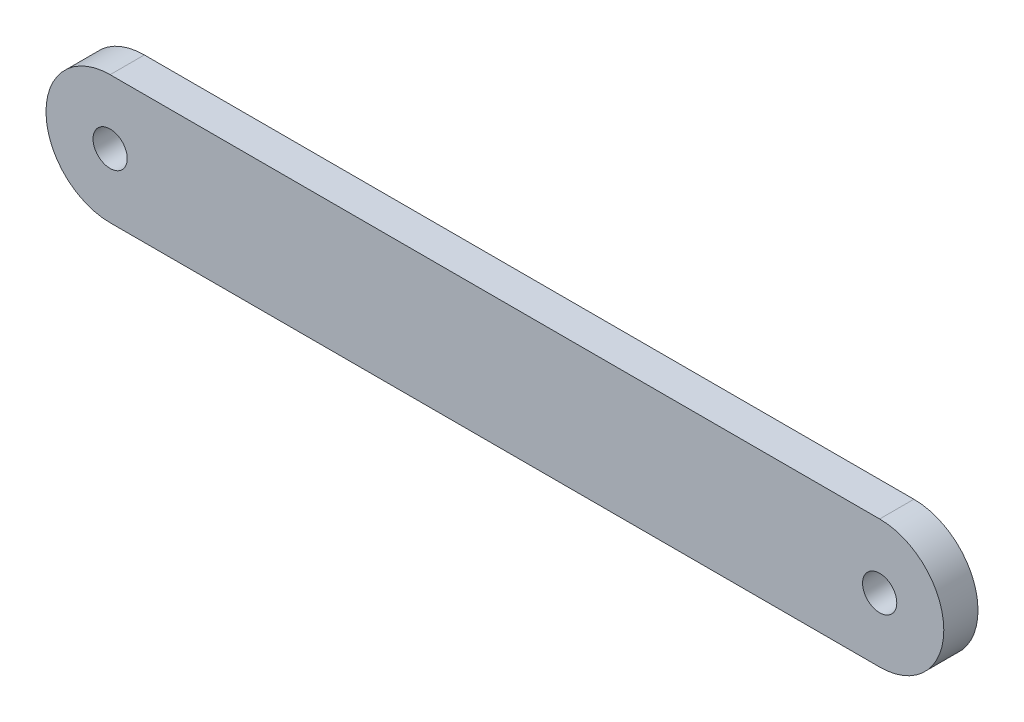
ISO-10303-21;
HEADER;
FILE_DESCRIPTION(('STEP AP214'),'2;1');
FILE_NAME('part.step','',(''),(''),'','','');
FILE_SCHEMA(('AUTOMOTIVE_DESIGN { 1 0 10303 214 1 1 1 1 }'));
ENDSEC;
DATA;
#1=APPLICATION_CONTEXT('core data for automotive mechanical design processes');
#2=APPLICATION_PROTOCOL_DEFINITION('international standard','automotive_design',2000,#1);
#3=PRODUCT_CONTEXT('',#1,'mechanical');
#4=PRODUCT('Part','Part','',(#3));
#5=PRODUCT_RELATED_PRODUCT_CATEGORY('part','',(#4));
#6=PRODUCT_DEFINITION_FORMATION('','',#4);
#7=PRODUCT_DEFINITION_CONTEXT('part definition',#1,'design');
#8=PRODUCT_DEFINITION('design','',#6,#7);
#9=PRODUCT_DEFINITION_SHAPE('','',#8);
#10=(LENGTH_UNIT() NAMED_UNIT(*) SI_UNIT(.MILLI.,.METRE.));
#11=(NAMED_UNIT(*) PLANE_ANGLE_UNIT() SI_UNIT($,.RADIAN.));
#12=(NAMED_UNIT(*) SI_UNIT($,.STERADIAN.) SOLID_ANGLE_UNIT());
#13=UNCERTAINTY_MEASURE_WITH_UNIT(LENGTH_MEASURE(1.E-05),#10,'distance_accuracy_value','');
#14=(GEOMETRIC_REPRESENTATION_CONTEXT(3) GLOBAL_UNCERTAINTY_ASSIGNED_CONTEXT((#13)) GLOBAL_UNIT_ASSIGNED_CONTEXT((#10,
#11,#12)) REPRESENTATION_CONTEXT('',''));
#15=CARTESIAN_POINT('',(0.,0.,0.));
#16=DIRECTION('',(0.,0.,1.));
#17=DIRECTION('',(1.,0.,0.));
#18=AXIS2_PLACEMENT_3D('',#15,#16,#17);
#19=CARTESIAN_POINT('',(90.,0.,4.));
#20=DIRECTION('',(0.,0.,-1.));
#21=DIRECTION('',(-1.,0.,0.));
#22=AXIS2_PLACEMENT_3D('',#19,#20,#21);
#23=CYLINDRICAL_SURFACE('',#22,7.5);
#24=CARTESIAN_POINT('',(90.,0.,0.));
#25=DIRECTION('',(0.,0.,1.));
#26=DIRECTION('',(1.,0.,0.));
#27=AXIS2_PLACEMENT_3D('',#24,#25,#26);
#28=CIRCLE('',#27,7.5);
#29=CARTESIAN_POINT('',(90.,-7.5,0.));
#30=VERTEX_POINT('',#29);
#31=CARTESIAN_POINT('',(90.,7.5,0.));
#32=VERTEX_POINT('',#31);
#33=EDGE_CURVE('E104',#30,#32,#28,.T.);
#34=ORIENTED_EDGE('',*,*,#33,.T.);
#35=DIRECTION('',(0.,0.,-1.));
#36=VECTOR('',#35,1.);
#37=CARTESIAN_POINT('',(90.,7.5,4.));
#38=LINE('',#37,#36);
#39=CARTESIAN_POINT('',(90.,7.5,4.));
#40=VERTEX_POINT('',#39);
#41=EDGE_CURVE('E61',#40,#32,#38,.T.);
#42=ORIENTED_EDGE('',*,*,#41,.F.);
#43=CARTESIAN_POINT('',(90.,0.,4.));
#44=DIRECTION('',(0.,0.,1.));
#45=DIRECTION('',(1.,0.,0.));
#46=AXIS2_PLACEMENT_3D('',#43,#44,#45);
#47=CIRCLE('',#46,7.5);
#48=CARTESIAN_POINT('',(90.,-7.5,4.));
#49=VERTEX_POINT('',#48);
#50=EDGE_CURVE('E95',#49,#40,#47,.T.);
#51=ORIENTED_EDGE('',*,*,#50,.F.);
#52=DIRECTION('',(0.,0.,-1.));
#53=VECTOR('',#52,1.);
#54=CARTESIAN_POINT('',(90.,-7.5,4.));
#55=LINE('',#54,#53);
#56=EDGE_CURVE('E12',#49,#30,#55,.T.);
#57=ORIENTED_EDGE('',*,*,#56,.T.);
#58=EDGE_LOOP('',(#34,#42,#51,#57));
#59=FACE_BOUND('',#58,.T.);
#60=ADVANCED_FACE('F52',(#59),#23,.T.);
#61=CARTESIAN_POINT('',(0.,7.5,4.));
#62=DIRECTION('',(0.,1.,0.));
#63=DIRECTION('',(0.,0.,1.));
#64=AXIS2_PLACEMENT_3D('',#61,#62,#63);
#65=PLANE('',#64);
#66=DIRECTION('',(1.,0.,0.));
#67=VECTOR('',#66,1.);
#68=CARTESIAN_POINT('',(0.,7.5,0.));
#69=LINE('',#68,#67);
#70=CARTESIAN_POINT('',(0.,7.5,0.));
#71=VERTEX_POINT('',#70);
#72=EDGE_CURVE('E124',#71,#32,#69,.T.);
#73=ORIENTED_EDGE('',*,*,#72,.F.);
#74=DIRECTION('',(0.,0.,-1.));
#75=VECTOR('',#74,1.);
#76=CARTESIAN_POINT('',(0.,7.5,4.));
#77=LINE('',#76,#75);
#78=CARTESIAN_POINT('',(0.,7.5,4.));
#79=VERTEX_POINT('',#78);
#80=EDGE_CURVE('E85',#79,#71,#77,.T.);
#81=ORIENTED_EDGE('',*,*,#80,.F.);
#82=DIRECTION('',(1.,0.,0.));
#83=VECTOR('',#82,1.);
#84=CARTESIAN_POINT('',(0.,7.5,4.));
#85=LINE('',#84,#83);
#86=EDGE_CURVE('E98',#79,#40,#85,.T.);
#87=ORIENTED_EDGE('',*,*,#86,.T.);
#88=ORIENTED_EDGE('',*,*,#41,.T.);
#89=EDGE_LOOP('',(#73,#81,#87,#88));
#90=FACE_BOUND('',#89,.T.);
#91=ADVANCED_FACE('F108',(#90),#65,.T.);
#92=CARTESIAN_POINT('',(0.,0.,4.));
#93=DIRECTION('',(0.,0.,-1.));
#94=DIRECTION('',(-1.,0.,0.));
#95=AXIS2_PLACEMENT_3D('',#92,#93,#94);
#96=CYLINDRICAL_SURFACE('',#95,7.5);
#97=CARTESIAN_POINT('',(0.,0.,0.));
#98=DIRECTION('',(0.,0.,1.));
#99=DIRECTION('',(1.,0.,0.));
#100=AXIS2_PLACEMENT_3D('',#97,#98,#99);
#101=CIRCLE('',#100,7.5);
#102=CARTESIAN_POINT('',(0.,-7.5,0.));
#103=VERTEX_POINT('',#102);
#104=EDGE_CURVE('E88',#71,#103,#101,.T.);
#105=ORIENTED_EDGE('',*,*,#104,.T.);
#106=DIRECTION('',(0.,0.,-1.));
#107=VECTOR('',#106,1.);
#108=CARTESIAN_POINT('',(0.,-7.5,4.));
#109=LINE('',#108,#107);
#110=CARTESIAN_POINT('',(0.,-7.5,4.));
#111=VERTEX_POINT('',#110);
#112=EDGE_CURVE('E110',#111,#103,#109,.T.);
#113=ORIENTED_EDGE('',*,*,#112,.F.);
#114=CARTESIAN_POINT('',(0.,0.,4.));
#115=DIRECTION('',(0.,0.,1.));
#116=DIRECTION('',(1.,0.,0.));
#117=AXIS2_PLACEMENT_3D('',#114,#115,#116);
#118=CIRCLE('',#117,7.5);
#119=EDGE_CURVE('E69',#79,#111,#118,.T.);
#120=ORIENTED_EDGE('',*,*,#119,.F.);
#121=ORIENTED_EDGE('',*,*,#80,.T.);
#122=EDGE_LOOP('',(#105,#113,#120,#121));
#123=FACE_BOUND('',#122,.T.);
#124=ADVANCED_FACE('F152',(#123),#96,.T.);
#125=CARTESIAN_POINT('',(0.,-7.5,4.));
#126=DIRECTION('',(0.,1.,0.));
#127=DIRECTION('',(0.,0.,1.));
#128=AXIS2_PLACEMENT_3D('',#125,#126,#127);
#129=PLANE('',#128);
#130=DIRECTION('',(1.,0.,0.));
#131=VECTOR('',#130,1.);
#132=CARTESIAN_POINT('',(0.,-7.5,0.));
#133=LINE('',#132,#131);
#134=EDGE_CURVE('E120',#103,#30,#133,.T.);
#135=ORIENTED_EDGE('',*,*,#134,.T.);
#136=ORIENTED_EDGE('',*,*,#56,.F.);
#137=DIRECTION('',(1.,0.,0.));
#138=VECTOR('',#137,1.);
#139=CARTESIAN_POINT('',(0.,-7.5,4.));
#140=LINE('',#139,#138);
#141=EDGE_CURVE('E100',#111,#49,#140,.T.);
#142=ORIENTED_EDGE('',*,*,#141,.F.);
#143=ORIENTED_EDGE('',*,*,#112,.T.);
#144=EDGE_LOOP('',(#135,#136,#142,#143));
#145=FACE_BOUND('',#144,.T.);
#146=ADVANCED_FACE('F131',(#145),#129,.F.);
#147=CARTESIAN_POINT('',(0.,0.,4.));
#148=DIRECTION('',(0.,0.,-1.));
#149=DIRECTION('',(-1.,0.,0.));
#150=AXIS2_PLACEMENT_3D('',#147,#148,#149);
#151=CYLINDRICAL_SURFACE('',#150,2.);
#152=CARTESIAN_POINT('',(0.,0.,4.));
#153=DIRECTION('',(0.,0.,1.));
#154=DIRECTION('',(1.,0.,0.));
#155=AXIS2_PLACEMENT_3D('',#152,#153,#154);
#156=CIRCLE('',#155,2.);
#157=CARTESIAN_POINT('',(2.,0.,4.));
#158=VERTEX_POINT('',#157);
#159=EDGE_CURVE('E163',#158,#158,#156,.T.);
#160=ORIENTED_EDGE('',*,*,#159,.T.);
#161=EDGE_LOOP('',(#160));
#162=FACE_BOUND('',#161,.T.);
#163=CARTESIAN_POINT('',(0.,0.,0.));
#164=DIRECTION('',(0.,0.,1.));
#165=DIRECTION('',(1.,0.,0.));
#166=AXIS2_PLACEMENT_3D('',#163,#164,#165);
#167=CIRCLE('',#166,2.);
#168=CARTESIAN_POINT('',(2.,0.,0.));
#169=VERTEX_POINT('',#168);
#170=EDGE_CURVE('E117',#169,#169,#167,.T.);
#171=ORIENTED_EDGE('',*,*,#170,.F.);
#172=EDGE_LOOP('',(#171));
#173=FACE_BOUND('',#172,.T.);
#174=ADVANCED_FACE('F143',(#162,#173),#151,.F.);
#175=CARTESIAN_POINT('',(90.,0.,4.));
#176=DIRECTION('',(0.,0.,-1.));
#177=DIRECTION('',(-1.,0.,0.));
#178=AXIS2_PLACEMENT_3D('',#175,#176,#177);
#179=CYLINDRICAL_SURFACE('',#178,2.);
#180=CARTESIAN_POINT('',(90.,0.,4.));
#181=DIRECTION('',(0.,0.,1.));
#182=DIRECTION('',(1.,0.,0.));
#183=AXIS2_PLACEMENT_3D('',#180,#181,#182);
#184=CIRCLE('',#183,2.);
#185=CARTESIAN_POINT('',(92.,0.,4.));
#186=VERTEX_POINT('',#185);
#187=EDGE_CURVE('E127',#186,#186,#184,.T.);
#188=ORIENTED_EDGE('',*,*,#187,.T.);
#189=EDGE_LOOP('',(#188));
#190=FACE_BOUND('',#189,.T.);
#191=CARTESIAN_POINT('',(90.,0.,0.));
#192=DIRECTION('',(0.,0.,1.));
#193=DIRECTION('',(1.,0.,0.));
#194=AXIS2_PLACEMENT_3D('',#191,#192,#193);
#195=CIRCLE('',#194,2.);
#196=CARTESIAN_POINT('',(92.,0.,0.));
#197=VERTEX_POINT('',#196);
#198=EDGE_CURVE('E114',#197,#197,#195,.T.);
#199=ORIENTED_EDGE('',*,*,#198,.F.);
#200=EDGE_LOOP('',(#199));
#201=FACE_BOUND('',#200,.T.);
#202=ADVANCED_FACE('F54',(#190,#201),#179,.F.);
#203=CARTESIAN_POINT('',(0.,0.,0.));
#204=DIRECTION('',(0.,0.,1.));
#205=DIRECTION('',(1.,0.,0.));
#206=AXIS2_PLACEMENT_3D('',#203,#204,#205);
#207=PLANE('',#206);
#208=ORIENTED_EDGE('',*,*,#198,.T.);
#209=EDGE_LOOP('',(#208));
#210=FACE_BOUND('',#209,.T.);
#211=ORIENTED_EDGE('',*,*,#170,.T.);
#212=EDGE_LOOP('',(#211));
#213=FACE_BOUND('',#212,.T.);
#214=ORIENTED_EDGE('',*,*,#134,.F.);
#215=ORIENTED_EDGE('',*,*,#104,.F.);
#216=ORIENTED_EDGE('',*,*,#72,.T.);
#217=ORIENTED_EDGE('',*,*,#33,.F.);
#218=EDGE_LOOP('',(#214,#215,#216,#217));
#219=FACE_BOUND('',#218,.T.);
#220=ADVANCED_FACE('F133',(#210,#213,#219),#207,.F.);
#221=CARTESIAN_POINT('',(0.,0.,4.));
#222=DIRECTION('',(0.,0.,1.));
#223=DIRECTION('',(1.,0.,0.));
#224=AXIS2_PLACEMENT_3D('',#221,#222,#223);
#225=PLANE('',#224);
#226=ORIENTED_EDGE('',*,*,#187,.F.);
#227=EDGE_LOOP('',(#226));
#228=FACE_BOUND('',#227,.T.);
#229=ORIENTED_EDGE('',*,*,#159,.F.);
#230=EDGE_LOOP('',(#229));
#231=FACE_BOUND('',#230,.T.);
#232=ORIENTED_EDGE('',*,*,#141,.T.);
#233=ORIENTED_EDGE('',*,*,#50,.T.);
#234=ORIENTED_EDGE('',*,*,#86,.F.);
#235=ORIENTED_EDGE('',*,*,#119,.T.);
#236=EDGE_LOOP('',(#232,#233,#234,#235));
#237=FACE_BOUND('',#236,.T.);
#238=ADVANCED_FACE('F96',(#228,#231,#237),#225,.T.);
#239=CLOSED_SHELL('',(#60,#91,#124,#146,#174,#202,#220,#238));
#240=MANIFOLD_SOLID_BREP('B2',#239);
#241=ADVANCED_BREP_SHAPE_REPRESENTATION('',(#18,#240),#14);
#242=SHAPE_DEFINITION_REPRESENTATION(#9,#241);
ENDSEC;
END-ISO-10303-21;
